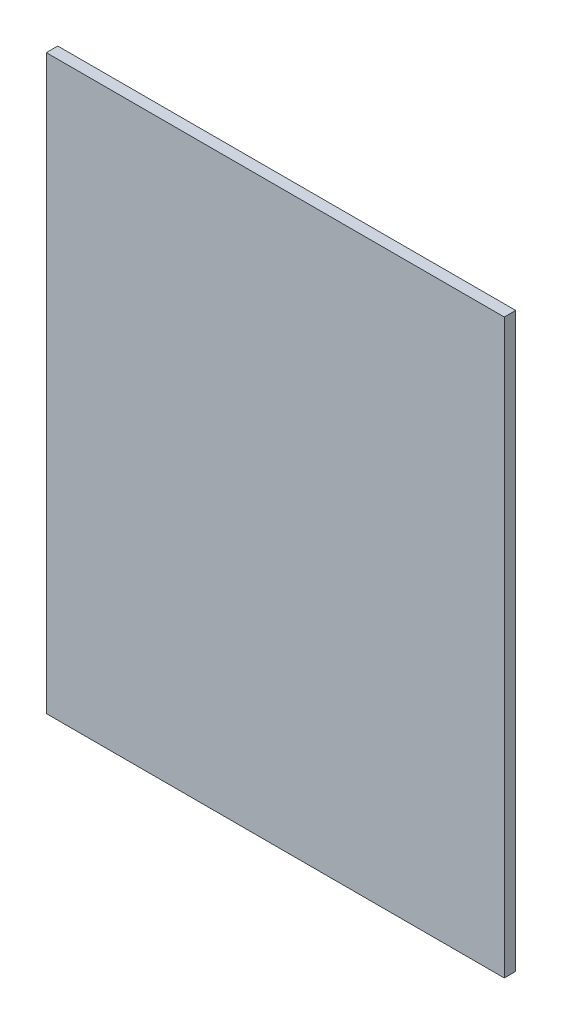
ISO-10303-21;
HEADER;
FILE_DESCRIPTION(('STEP AP214'),'2;1');
FILE_NAME('part.step','',(''),(''),'','','');
FILE_SCHEMA(('AUTOMOTIVE_DESIGN { 1 0 10303 214 1 1 1 1 }'));
ENDSEC;
DATA;
#1=APPLICATION_CONTEXT('core data for automotive mechanical design processes');
#2=APPLICATION_PROTOCOL_DEFINITION('international standard','automotive_design',2000,#1);
#3=PRODUCT_CONTEXT('',#1,'mechanical');
#4=PRODUCT('Part','Part','',(#3));
#5=PRODUCT_RELATED_PRODUCT_CATEGORY('part','',(#4));
#6=PRODUCT_DEFINITION_FORMATION('','',#4);
#7=PRODUCT_DEFINITION_CONTEXT('part definition',#1,'design');
#8=PRODUCT_DEFINITION('design','',#6,#7);
#9=PRODUCT_DEFINITION_SHAPE('','',#8);
#10=(LENGTH_UNIT() NAMED_UNIT(*) SI_UNIT(.MILLI.,.METRE.));
#11=(NAMED_UNIT(*) PLANE_ANGLE_UNIT() SI_UNIT($,.RADIAN.));
#12=(NAMED_UNIT(*) SI_UNIT($,.STERADIAN.) SOLID_ANGLE_UNIT());
#13=UNCERTAINTY_MEASURE_WITH_UNIT(LENGTH_MEASURE(1.E-05),#10,'distance_accuracy_value','');
#14=(GEOMETRIC_REPRESENTATION_CONTEXT(3) GLOBAL_UNCERTAINTY_ASSIGNED_CONTEXT((#13)) GLOBAL_UNIT_ASSIGNED_CONTEXT((#10,
#11,#12)) REPRESENTATION_CONTEXT('',''));
#15=CARTESIAN_POINT('',(0.,0.,0.));
#16=DIRECTION('',(0.,0.,1.));
#17=DIRECTION('',(1.,0.,0.));
#18=AXIS2_PLACEMENT_3D('',#15,#16,#17);
#19=CARTESIAN_POINT('',(200.,250.,10.));
#20=DIRECTION('',(-1.,0.,0.));
#21=DIRECTION('',(0.,-1.,0.));
#22=AXIS2_PLACEMENT_3D('',#19,#20,#21);
#23=PLANE('',#22);
#24=DIRECTION('',(0.,1.,0.));
#25=VECTOR('',#24,1.);
#26=CARTESIAN_POINT('',(200.,250.,0.));
#27=LINE('',#26,#25);
#28=CARTESIAN_POINT('',(200.,-250.,0.));
#29=VERTEX_POINT('',#28);
#30=CARTESIAN_POINT('',(200.,250.,0.));
#31=VERTEX_POINT('',#30);
#32=EDGE_CURVE('E98',#29,#31,#27,.T.);
#33=ORIENTED_EDGE('',*,*,#32,.T.);
#34=DIRECTION('',(0.,0.,-1.));
#35=VECTOR('',#34,1.);
#36=CARTESIAN_POINT('',(200.,250.,10.));
#37=LINE('',#36,#35);
#38=CARTESIAN_POINT('',(200.,250.,10.));
#39=VERTEX_POINT('',#38);
#40=EDGE_CURVE('E11',#39,#31,#37,.T.);
#41=ORIENTED_EDGE('',*,*,#40,.F.);
#42=DIRECTION('',(0.,1.,0.));
#43=VECTOR('',#42,1.);
#44=CARTESIAN_POINT('',(200.,250.,10.));
#45=LINE('',#44,#43);
#46=CARTESIAN_POINT('',(200.,-250.,10.));
#47=VERTEX_POINT('',#46);
#48=EDGE_CURVE('E86',#47,#39,#45,.T.);
#49=ORIENTED_EDGE('',*,*,#48,.F.);
#50=DIRECTION('',(0.,0.,-1.));
#51=VECTOR('',#50,1.);
#52=CARTESIAN_POINT('',(200.,-250.,10.));
#53=LINE('',#52,#51);
#54=EDGE_CURVE('E94',#47,#29,#53,.T.);
#55=ORIENTED_EDGE('',*,*,#54,.T.);
#56=EDGE_LOOP('',(#33,#41,#49,#55));
#57=FACE_BOUND('',#56,.T.);
#58=ADVANCED_FACE('F35',(#57),#23,.F.);
#59=CARTESIAN_POINT('',(-200.,250.,10.));
#60=DIRECTION('',(0.,-1.,0.));
#61=DIRECTION('',(0.,0.,-1.));
#62=AXIS2_PLACEMENT_3D('',#59,#60,#61);
#63=PLANE('',#62);
#64=DIRECTION('',(-1.,0.,0.));
#65=VECTOR('',#64,1.);
#66=CARTESIAN_POINT('',(-200.,250.,0.));
#67=LINE('',#66,#65);
#68=CARTESIAN_POINT('',(-200.,250.,0.));
#69=VERTEX_POINT('',#68);
#70=EDGE_CURVE('E90',#31,#69,#67,.T.);
#71=ORIENTED_EDGE('',*,*,#70,.T.);
#72=DIRECTION('',(0.,0.,-1.));
#73=VECTOR('',#72,1.);
#74=CARTESIAN_POINT('',(-200.,250.,10.));
#75=LINE('',#74,#73);
#76=CARTESIAN_POINT('',(-200.,250.,10.));
#77=VERTEX_POINT('',#76);
#78=EDGE_CURVE('E43',#77,#69,#75,.T.);
#79=ORIENTED_EDGE('',*,*,#78,.F.);
#80=DIRECTION('',(-1.,0.,0.));
#81=VECTOR('',#80,1.);
#82=CARTESIAN_POINT('',(-200.,250.,10.));
#83=LINE('',#82,#81);
#84=EDGE_CURVE('E81',#39,#77,#83,.T.);
#85=ORIENTED_EDGE('',*,*,#84,.F.);
#86=ORIENTED_EDGE('',*,*,#40,.T.);
#87=EDGE_LOOP('',(#71,#79,#85,#86));
#88=FACE_BOUND('',#87,.T.);
#89=ADVANCED_FACE('F89',(#88),#63,.F.);
#90=CARTESIAN_POINT('',(-200.,250.,10.));
#91=DIRECTION('',(1.,0.,0.));
#92=DIRECTION('',(0.,1.,0.));
#93=AXIS2_PLACEMENT_3D('',#90,#91,#92);
#94=PLANE('',#93);
#95=DIRECTION('',(0.,-1.,0.));
#96=VECTOR('',#95,1.);
#97=CARTESIAN_POINT('',(-200.,250.,0.));
#98=LINE('',#97,#96);
#99=CARTESIAN_POINT('',(-200.,-250.,0.));
#100=VERTEX_POINT('',#99);
#101=EDGE_CURVE('E68',#69,#100,#98,.T.);
#102=ORIENTED_EDGE('',*,*,#101,.T.);
#103=DIRECTION('',(0.,0.,-1.));
#104=VECTOR('',#103,1.);
#105=CARTESIAN_POINT('',(-200.,-250.,10.));
#106=LINE('',#105,#104);
#107=CARTESIAN_POINT('',(-200.,-250.,10.));
#108=VERTEX_POINT('',#107);
#109=EDGE_CURVE('E91',#108,#100,#106,.T.);
#110=ORIENTED_EDGE('',*,*,#109,.F.);
#111=DIRECTION('',(0.,-1.,0.));
#112=VECTOR('',#111,1.);
#113=CARTESIAN_POINT('',(-200.,250.,10.));
#114=LINE('',#113,#112);
#115=EDGE_CURVE('E84',#77,#108,#114,.T.);
#116=ORIENTED_EDGE('',*,*,#115,.F.);
#117=ORIENTED_EDGE('',*,*,#78,.T.);
#118=EDGE_LOOP('',(#102,#110,#116,#117));
#119=FACE_BOUND('',#118,.T.);
#120=ADVANCED_FACE('F92',(#119),#94,.F.);
#121=CARTESIAN_POINT('',(-200.,-250.,10.));
#122=DIRECTION('',(0.,1.,0.));
#123=DIRECTION('',(0.,0.,1.));
#124=AXIS2_PLACEMENT_3D('',#121,#122,#123);
#125=PLANE('',#124);
#126=DIRECTION('',(1.,0.,0.));
#127=VECTOR('',#126,1.);
#128=CARTESIAN_POINT('',(-200.,-250.,0.));
#129=LINE('',#128,#127);
#130=EDGE_CURVE('E74',#100,#29,#129,.T.);
#131=ORIENTED_EDGE('',*,*,#130,.T.);
#132=ORIENTED_EDGE('',*,*,#54,.F.);
#133=DIRECTION('',(1.,0.,0.));
#134=VECTOR('',#133,1.);
#135=CARTESIAN_POINT('',(-200.,-250.,10.));
#136=LINE('',#135,#134);
#137=EDGE_CURVE('E51',#108,#47,#136,.T.);
#138=ORIENTED_EDGE('',*,*,#137,.F.);
#139=ORIENTED_EDGE('',*,*,#109,.T.);
#140=EDGE_LOOP('',(#131,#132,#138,#139));
#141=FACE_BOUND('',#140,.T.);
#142=ADVANCED_FACE('F105',(#141),#125,.F.);
#143=CARTESIAN_POINT('',(0.,0.,10.));
#144=DIRECTION('',(0.,0.,1.));
#145=DIRECTION('',(1.,0.,0.));
#146=AXIS2_PLACEMENT_3D('',#143,#144,#145);
#147=PLANE('',#146);
#148=ORIENTED_EDGE('',*,*,#48,.T.);
#149=ORIENTED_EDGE('',*,*,#84,.T.);
#150=ORIENTED_EDGE('',*,*,#115,.T.);
#151=ORIENTED_EDGE('',*,*,#137,.T.);
#152=EDGE_LOOP('',(#148,#149,#150,#151));
#153=FACE_BOUND('',#152,.T.);
#154=ADVANCED_FACE('F82',(#153),#147,.T.);
#155=CARTESIAN_POINT('',(0.,0.,0.));
#156=DIRECTION('',(0.,0.,1.));
#157=DIRECTION('',(1.,0.,0.));
#158=AXIS2_PLACEMENT_3D('',#155,#156,#157);
#159=PLANE('',#158);
#160=ORIENTED_EDGE('',*,*,#32,.F.);
#161=ORIENTED_EDGE('',*,*,#130,.F.);
#162=ORIENTED_EDGE('',*,*,#101,.F.);
#163=ORIENTED_EDGE('',*,*,#70,.F.);
#164=EDGE_LOOP('',(#160,#161,#162,#163));
#165=FACE_BOUND('',#164,.T.);
#166=ADVANCED_FACE('F108',(#165),#159,.F.);
#167=CLOSED_SHELL('',(#58,#89,#120,#142,#154,#166));
#168=MANIFOLD_SOLID_BREP('B2',#167);
#169=ADVANCED_BREP_SHAPE_REPRESENTATION('',(#18,#168),#14);
#170=SHAPE_DEFINITION_REPRESENTATION(#9,#169);
ENDSEC;
END-ISO-10303-21;
